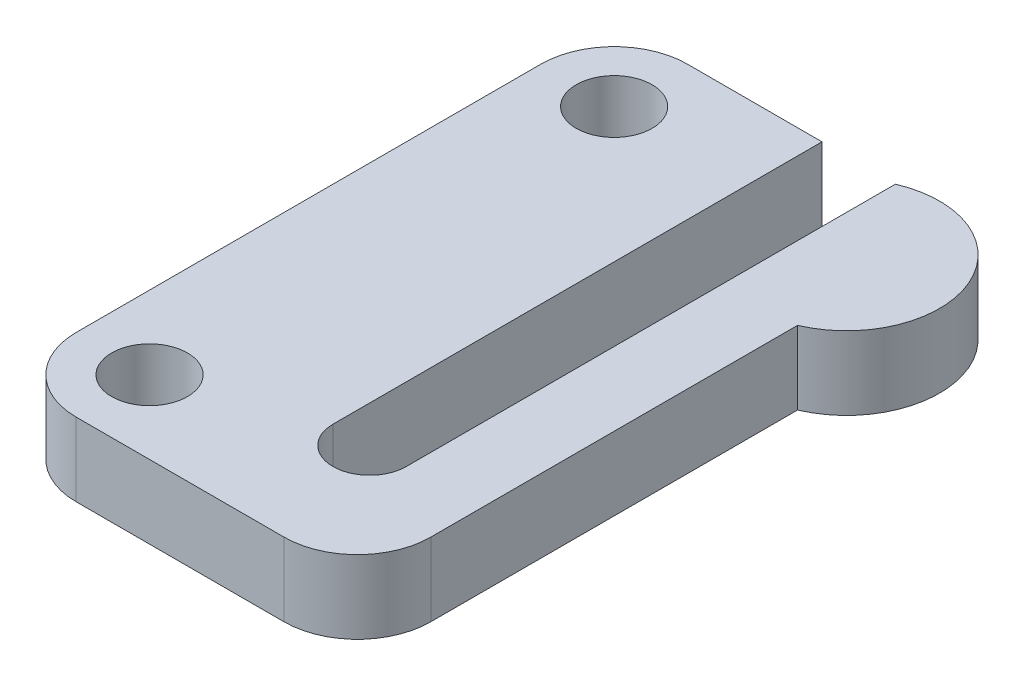
ISO-10303-21;
HEADER;
FILE_DESCRIPTION(('STEP AP214'),'2;1');
FILE_NAME('part.step','',(''),(''),'','','');
FILE_SCHEMA(('AUTOMOTIVE_DESIGN { 1 0 10303 214 1 1 1 1 }'));
ENDSEC;
DATA;
#1=APPLICATION_CONTEXT('core data for automotive mechanical design processes');
#2=APPLICATION_PROTOCOL_DEFINITION('international standard','automotive_design',2000,#1);
#3=PRODUCT_CONTEXT('',#1,'mechanical');
#4=PRODUCT('Part','Part','',(#3));
#5=PRODUCT_RELATED_PRODUCT_CATEGORY('part','',(#4));
#6=PRODUCT_DEFINITION_FORMATION('','',#4);
#7=PRODUCT_DEFINITION_CONTEXT('part definition',#1,'design');
#8=PRODUCT_DEFINITION('design','',#6,#7);
#9=PRODUCT_DEFINITION_SHAPE('','',#8);
#10=(LENGTH_UNIT() NAMED_UNIT(*) SI_UNIT(.MILLI.,.METRE.));
#11=(NAMED_UNIT(*) PLANE_ANGLE_UNIT() SI_UNIT($,.RADIAN.));
#12=(NAMED_UNIT(*) SI_UNIT($,.STERADIAN.) SOLID_ANGLE_UNIT());
#13=UNCERTAINTY_MEASURE_WITH_UNIT(LENGTH_MEASURE(1.E-05),#10,'distance_accuracy_value','');
#14=(GEOMETRIC_REPRESENTATION_CONTEXT(3) GLOBAL_UNCERTAINTY_ASSIGNED_CONTEXT((#13)) GLOBAL_UNIT_ASSIGNED_CONTEXT((#10,
#11,#12)) REPRESENTATION_CONTEXT('',''));
#15=CARTESIAN_POINT('',(0.,0.,0.));
#16=DIRECTION('',(0.,0.,1.));
#17=DIRECTION('',(1.,0.,0.));
#18=AXIS2_PLACEMENT_3D('',#15,#16,#17);
#19=CARTESIAN_POINT('',(0.499999999999998,-3.,-9.));
#20=DIRECTION('',(0.,1.,0.));
#21=DIRECTION('',(0.,0.,1.));
#22=AXIS2_PLACEMENT_3D('',#19,#20,#21);
#23=CYLINDRICAL_SURFACE('',#22,3.80788655293195);
#24=CARTESIAN_POINT('',(0.499999999999998,0.,-9.));
#25=DIRECTION('',(0.,1.,0.));
#26=DIRECTION('',(0.,0.,1.));
#27=AXIS2_PLACEMENT_3D('',#24,#25,#26);
#28=CIRCLE('',#27,3.80788655293195);
#29=CARTESIAN_POINT('',(2.,0.,-5.5));
#30=VERTEX_POINT('',#29);
#31=CARTESIAN_POINT('',(-0.999999999999998,0.,-12.5));
#32=VERTEX_POINT('',#31);
#33=EDGE_CURVE('E164',#30,#32,#28,.T.);
#34=ORIENTED_EDGE('',*,*,#33,.F.);
#35=DIRECTION('',(0.,1.,0.));
#36=VECTOR('',#35,1.);
#37=CARTESIAN_POINT('',(2.,-3.,-5.5));
#38=LINE('',#37,#36);
#39=CARTESIAN_POINT('',(2.,-3.,-5.5));
#40=VERTEX_POINT('',#39);
#41=EDGE_CURVE('E143',#40,#30,#38,.T.);
#42=ORIENTED_EDGE('',*,*,#41,.F.);
#43=CARTESIAN_POINT('',(0.499999999999998,-3.,-9.));
#44=DIRECTION('',(0.,1.,0.));
#45=DIRECTION('',(0.,0.,1.));
#46=AXIS2_PLACEMENT_3D('',#43,#44,#45);
#47=CIRCLE('',#46,3.80788655293195);
#48=CARTESIAN_POINT('',(-0.999999999999998,-3.,-12.5));
#49=VERTEX_POINT('',#48);
#50=EDGE_CURVE('E136',#40,#49,#47,.T.);
#51=ORIENTED_EDGE('',*,*,#50,.T.);
#52=DIRECTION('',(0.,1.,0.));
#53=VECTOR('',#52,1.);
#54=CARTESIAN_POINT('',(-0.999999999999998,-3.,-12.5));
#55=LINE('',#54,#53);
#56=EDGE_CURVE('E119',#49,#32,#55,.T.);
#57=ORIENTED_EDGE('',*,*,#56,.T.);
#58=EDGE_LOOP('',(#34,#42,#51,#57));
#59=FACE_BOUND('',#58,.T.);
#60=ADVANCED_FACE('F33',(#59),#23,.T.);
#61=CARTESIAN_POINT('',(2.,-3.,7.5));
#62=DIRECTION('',(1.,0.,0.));
#63=DIRECTION('',(0.,0.,-1.));
#64=AXIS2_PLACEMENT_3D('',#61,#62,#63);
#65=PLANE('',#64);
#66=DIRECTION('',(0.,0.,-1.));
#67=VECTOR('',#66,1.);
#68=CARTESIAN_POINT('',(2.,0.,7.5));
#69=LINE('',#68,#67);
#70=CARTESIAN_POINT('',(2.,0.,9.5));
#71=VERTEX_POINT('',#70);
#72=EDGE_CURVE('E144',#71,#30,#69,.T.);
#73=ORIENTED_EDGE('',*,*,#72,.F.);
#74=DIRECTION('',(0.,1.,0.));
#75=VECTOR('',#74,1.);
#76=CARTESIAN_POINT('',(2.,-3.,9.5));
#77=LINE('',#76,#75);
#78=CARTESIAN_POINT('',(2.,-3.,9.5));
#79=VERTEX_POINT('',#78);
#80=EDGE_CURVE('E192',#71,#79,#77,.F.);
#81=ORIENTED_EDGE('',*,*,#80,.T.);
#82=DIRECTION('',(0.,0.,-1.));
#83=VECTOR('',#82,1.);
#84=CARTESIAN_POINT('',(2.,-3.,12.5));
#85=LINE('',#84,#83);
#86=EDGE_CURVE('E130',#79,#40,#85,.T.);
#87=ORIENTED_EDGE('',*,*,#86,.T.);
#88=ORIENTED_EDGE('',*,*,#41,.T.);
#89=EDGE_LOOP('',(#73,#81,#87,#88));
#90=FACE_BOUND('',#89,.T.);
#91=ADVANCED_FACE('F226',(#90),#65,.T.);
#92=CARTESIAN_POINT('',(-12.5,-3.,12.5));
#93=DIRECTION('',(0.,0.,1.));
#94=DIRECTION('',(1.,0.,0.));
#95=AXIS2_PLACEMENT_3D('',#92,#93,#94);
#96=PLANE('',#95);
#97=DIRECTION('',(1.,0.,0.));
#98=VECTOR('',#97,1.);
#99=CARTESIAN_POINT('',(-12.5,0.,12.5));
#100=LINE('',#99,#98);
#101=CARTESIAN_POINT('',(-9.5,0.,12.5));
#102=VERTEX_POINT('',#101);
#103=CARTESIAN_POINT('',(-1.,0.,12.5));
#104=VERTEX_POINT('',#103);
#105=EDGE_CURVE('E146',#102,#104,#100,.T.);
#106=ORIENTED_EDGE('',*,*,#105,.F.);
#107=DIRECTION('',(0.,1.,0.));
#108=VECTOR('',#107,1.);
#109=CARTESIAN_POINT('',(-9.5,-3.,12.5));
#110=LINE('',#109,#108);
#111=CARTESIAN_POINT('',(-9.5,-3.,12.5));
#112=VERTEX_POINT('',#111);
#113=EDGE_CURVE('E56',#102,#112,#110,.F.);
#114=ORIENTED_EDGE('',*,*,#113,.T.);
#115=DIRECTION('',(1.,0.,0.));
#116=VECTOR('',#115,1.);
#117=CARTESIAN_POINT('',(-12.5,-3.,12.5));
#118=LINE('',#117,#116);
#119=CARTESIAN_POINT('',(-1.,-3.,12.5));
#120=VERTEX_POINT('',#119);
#121=EDGE_CURVE('E161',#112,#120,#118,.T.);
#122=ORIENTED_EDGE('',*,*,#121,.T.);
#123=DIRECTION('',(0.,1.,0.));
#124=VECTOR('',#123,1.);
#125=CARTESIAN_POINT('',(-0.999999999999999,-3.,12.5));
#126=LINE('',#125,#124);
#127=EDGE_CURVE('E182',#120,#104,#126,.T.);
#128=ORIENTED_EDGE('',*,*,#127,.T.);
#129=EDGE_LOOP('',(#106,#114,#122,#128));
#130=FACE_BOUND('',#129,.T.);
#131=ADVANCED_FACE('F218',(#130),#96,.T.);
#132=CARTESIAN_POINT('',(-12.5,-3.,12.5));
#133=DIRECTION('',(-1.,0.,0.));
#134=DIRECTION('',(0.,0.,1.));
#135=AXIS2_PLACEMENT_3D('',#132,#133,#134);
#136=PLANE('',#135);
#137=DIRECTION('',(0.,0.,1.));
#138=VECTOR('',#137,1.);
#139=CARTESIAN_POINT('',(-12.5,-3.,12.5));
#140=LINE('',#139,#138);
#141=CARTESIAN_POINT('',(-12.5,-3.,-9.49999999999999));
#142=VERTEX_POINT('',#141);
#143=CARTESIAN_POINT('',(-12.5,-3.,9.5));
#144=VERTEX_POINT('',#143);
#145=EDGE_CURVE('E158',#142,#144,#140,.T.);
#146=ORIENTED_EDGE('',*,*,#145,.T.);
#147=DIRECTION('',(0.,1.,0.));
#148=VECTOR('',#147,1.);
#149=CARTESIAN_POINT('',(-12.5,-3.,9.5));
#150=LINE('',#149,#148);
#151=CARTESIAN_POINT('',(-12.5,0.,9.5));
#152=VERTEX_POINT('',#151);
#153=EDGE_CURVE('E199',#144,#152,#150,.T.);
#154=ORIENTED_EDGE('',*,*,#153,.T.);
#155=DIRECTION('',(0.,0.,1.));
#156=VECTOR('',#155,1.);
#157=CARTESIAN_POINT('',(-12.5,0.,12.5));
#158=LINE('',#157,#156);
#159=CARTESIAN_POINT('',(-12.5,0.,-9.49999999999999));
#160=VERTEX_POINT('',#159);
#161=EDGE_CURVE('E177',#160,#152,#158,.T.);
#162=ORIENTED_EDGE('',*,*,#161,.F.);
#163=DIRECTION('',(0.,1.,0.));
#164=VECTOR('',#163,1.);
#165=CARTESIAN_POINT('',(-12.5,-3.,-9.5));
#166=LINE('',#165,#164);
#167=EDGE_CURVE('E197',#160,#142,#166,.F.);
#168=ORIENTED_EDGE('',*,*,#167,.T.);
#169=EDGE_LOOP('',(#146,#154,#162,#168));
#170=FACE_BOUND('',#169,.T.);
#171=ADVANCED_FACE('F211',(#170),#136,.T.);
#172=CARTESIAN_POINT('',(-4.,-3.,-12.5));
#173=DIRECTION('',(0.,0.,-1.));
#174=DIRECTION('',(-1.,0.,0.));
#175=AXIS2_PLACEMENT_3D('',#172,#173,#174);
#176=PLANE('',#175);
#177=DIRECTION('',(-1.,0.,0.));
#178=VECTOR('',#177,1.);
#179=CARTESIAN_POINT('',(-4.,-3.,-12.5));
#180=LINE('',#179,#178);
#181=CARTESIAN_POINT('',(-4.,-3.,-12.5));
#182=VERTEX_POINT('',#181);
#183=CARTESIAN_POINT('',(-9.5,-3.,-12.5));
#184=VERTEX_POINT('',#183);
#185=EDGE_CURVE('E156',#182,#184,#180,.T.);
#186=ORIENTED_EDGE('',*,*,#185,.T.);
#187=DIRECTION('',(0.,1.,0.));
#188=VECTOR('',#187,1.);
#189=CARTESIAN_POINT('',(-9.5,-3.,-12.5));
#190=LINE('',#189,#188);
#191=CARTESIAN_POINT('',(-9.5,0.,-12.5));
#192=VERTEX_POINT('',#191);
#193=EDGE_CURVE('E11',#184,#192,#190,.T.);
#194=ORIENTED_EDGE('',*,*,#193,.T.);
#195=DIRECTION('',(-1.,0.,0.));
#196=VECTOR('',#195,1.);
#197=CARTESIAN_POINT('',(-4.,0.,-12.5));
#198=LINE('',#197,#196);
#199=CARTESIAN_POINT('',(-4.,0.,-12.5));
#200=VERTEX_POINT('',#199);
#201=EDGE_CURVE('E174',#200,#192,#198,.T.);
#202=ORIENTED_EDGE('',*,*,#201,.F.);
#203=DIRECTION('',(0.,1.,0.));
#204=VECTOR('',#203,1.);
#205=CARTESIAN_POINT('',(-4.,-3.,-12.5));
#206=LINE('',#205,#204);
#207=EDGE_CURVE('E183',#182,#200,#206,.T.);
#208=ORIENTED_EDGE('',*,*,#207,.F.);
#209=EDGE_LOOP('',(#186,#194,#202,#208));
#210=FACE_BOUND('',#209,.T.);
#211=ADVANCED_FACE('F235',(#210),#176,.T.);
#212=CARTESIAN_POINT('',(-4.,-3.,7.5));
#213=DIRECTION('',(1.,0.,0.));
#214=DIRECTION('',(0.,0.,-1.));
#215=AXIS2_PLACEMENT_3D('',#212,#213,#214);
#216=PLANE('',#215);
#217=DIRECTION('',(0.,0.,-1.));
#218=VECTOR('',#217,1.);
#219=CARTESIAN_POINT('',(-4.,0.,7.5));
#220=LINE('',#219,#218);
#221=CARTESIAN_POINT('',(-4.,0.,7.5));
#222=VERTEX_POINT('',#221);
#223=EDGE_CURVE('E171',#222,#200,#220,.T.);
#224=ORIENTED_EDGE('',*,*,#223,.F.);
#225=DIRECTION('',(0.,1.,0.));
#226=VECTOR('',#225,1.);
#227=CARTESIAN_POINT('',(-4.,-3.,7.5));
#228=LINE('',#227,#226);
#229=CARTESIAN_POINT('',(-4.,-3.,7.5));
#230=VERTEX_POINT('',#229);
#231=EDGE_CURVE('E185',#230,#222,#228,.T.);
#232=ORIENTED_EDGE('',*,*,#231,.F.);
#233=DIRECTION('',(0.,0.,-1.));
#234=VECTOR('',#233,1.);
#235=CARTESIAN_POINT('',(-4.,-3.,7.5));
#236=LINE('',#235,#234);
#237=EDGE_CURVE('E153',#230,#182,#236,.T.);
#238=ORIENTED_EDGE('',*,*,#237,.T.);
#239=ORIENTED_EDGE('',*,*,#207,.T.);
#240=EDGE_LOOP('',(#224,#232,#238,#239));
#241=FACE_BOUND('',#240,.T.);
#242=ADVANCED_FACE('F232',(#241),#216,.T.);
#243=CARTESIAN_POINT('',(-2.5,-3.,7.5));
#244=DIRECTION('',(0.,1.,0.));
#245=DIRECTION('',(0.,0.,1.));
#246=AXIS2_PLACEMENT_3D('',#243,#244,#245);
#247=CYLINDRICAL_SURFACE('',#246,1.5);
#248=CARTESIAN_POINT('',(-2.5,0.,7.5));
#249=DIRECTION('',(0.,-1.,0.));
#250=DIRECTION('',(0.,0.,-1.));
#251=AXIS2_PLACEMENT_3D('',#248,#249,#250);
#252=CIRCLE('',#251,1.5);
#253=CARTESIAN_POINT('',(-0.999999999999996,0.,7.5));
#254=VERTEX_POINT('',#253);
#255=EDGE_CURVE('E168',#254,#222,#252,.T.);
#256=ORIENTED_EDGE('',*,*,#255,.F.);
#257=DIRECTION('',(0.,1.,0.));
#258=VECTOR('',#257,1.);
#259=CARTESIAN_POINT('',(-0.999999999999996,-3.,7.5));
#260=LINE('',#259,#258);
#261=CARTESIAN_POINT('',(-0.999999999999996,-3.,7.5));
#262=VERTEX_POINT('',#261);
#263=EDGE_CURVE('E129',#262,#254,#260,.T.);
#264=ORIENTED_EDGE('',*,*,#263,.F.);
#265=CARTESIAN_POINT('',(-2.5,-3.,7.5));
#266=DIRECTION('',(0.,-1.,0.));
#267=DIRECTION('',(0.,0.,-1.));
#268=AXIS2_PLACEMENT_3D('',#265,#266,#267);
#269=CIRCLE('',#268,1.5);
#270=EDGE_CURVE('E139',#262,#230,#269,.T.);
#271=ORIENTED_EDGE('',*,*,#270,.T.);
#272=ORIENTED_EDGE('',*,*,#231,.T.);
#273=EDGE_LOOP('',(#256,#264,#271,#272));
#274=FACE_BOUND('',#273,.T.);
#275=ADVANCED_FACE('F230',(#274),#247,.F.);
#276=CARTESIAN_POINT('',(-0.999999999999998,-3.,-12.5));
#277=DIRECTION('',(-1.,0.,0.));
#278=DIRECTION('',(0.,0.,1.));
#279=AXIS2_PLACEMENT_3D('',#276,#277,#278);
#280=PLANE('',#279);
#281=DIRECTION('',(0.,0.,1.));
#282=VECTOR('',#281,1.);
#283=CARTESIAN_POINT('',(-0.999999999999998,0.,-12.5));
#284=LINE('',#283,#282);
#285=EDGE_CURVE('E124',#32,#254,#284,.T.);
#286=ORIENTED_EDGE('',*,*,#285,.F.);
#287=ORIENTED_EDGE('',*,*,#56,.F.);
#288=DIRECTION('',(0.,0.,1.));
#289=VECTOR('',#288,1.);
#290=CARTESIAN_POINT('',(-0.999999999999998,-3.,-12.5));
#291=LINE('',#290,#289);
#292=EDGE_CURVE('E122',#49,#262,#291,.T.);
#293=ORIENTED_EDGE('',*,*,#292,.T.);
#294=ORIENTED_EDGE('',*,*,#263,.T.);
#295=EDGE_LOOP('',(#286,#287,#293,#294));
#296=FACE_BOUND('',#295,.T.);
#297=ADVANCED_FACE('F121',(#296),#280,.T.);
#298=CARTESIAN_POINT('',(0.499999999999998,-3.,-9.));
#299=DIRECTION('',(0.,1.,0.));
#300=DIRECTION('',(0.,0.,1.));
#301=AXIS2_PLACEMENT_3D('',#298,#299,#300);
#302=PLANE('',#301);
#303=CARTESIAN_POINT('',(-9.4999999999998,-3.,9.5));
#304=DIRECTION('',(0.,1.,0.));
#305=DIRECTION('',(0.,0.,1.));
#306=AXIS2_PLACEMENT_3D('',#303,#304,#305);
#307=CIRCLE('',#306,1.55);
#308=CARTESIAN_POINT('',(-9.4999999999998,-3.,11.05));
#309=VERTEX_POINT('',#308);
#310=EDGE_CURVE('E374',#309,#309,#307,.T.);
#311=ORIENTED_EDGE('',*,*,#310,.T.);
#312=EDGE_LOOP('',(#311));
#313=FACE_BOUND('',#312,.T.);
#314=CARTESIAN_POINT('',(-9.5,-3.,-9.5));
#315=DIRECTION('',(0.,1.,0.));
#316=DIRECTION('',(0.,0.,1.));
#317=AXIS2_PLACEMENT_3D('',#314,#315,#316);
#318=CIRCLE('',#317,1.55);
#319=CARTESIAN_POINT('',(-9.5,-3.,-7.95));
#320=VERTEX_POINT('',#319);
#321=EDGE_CURVE('E166',#320,#320,#318,.T.);
#322=ORIENTED_EDGE('',*,*,#321,.T.);
#323=EDGE_LOOP('',(#322));
#324=FACE_BOUND('',#323,.T.);
#325=ORIENTED_EDGE('',*,*,#121,.F.);
#326=CARTESIAN_POINT('',(-9.5,-3.,9.5));
#327=DIRECTION('',(0.,1.,0.));
#328=DIRECTION('',(0.,0.,1.));
#329=AXIS2_PLACEMENT_3D('',#326,#327,#328);
#330=CIRCLE('',#329,3.);
#331=EDGE_CURVE('E41',#112,#144,#330,.F.);
#332=ORIENTED_EDGE('',*,*,#331,.T.);
#333=ORIENTED_EDGE('',*,*,#145,.F.);
#334=CARTESIAN_POINT('',(-9.5,-3.,-9.5));
#335=DIRECTION('',(0.,1.,0.));
#336=DIRECTION('',(0.,0.,1.));
#337=AXIS2_PLACEMENT_3D('',#334,#335,#336);
#338=CIRCLE('',#337,3.);
#339=EDGE_CURVE('E48',#142,#184,#338,.F.);
#340=ORIENTED_EDGE('',*,*,#339,.T.);
#341=ORIENTED_EDGE('',*,*,#185,.F.);
#342=ORIENTED_EDGE('',*,*,#237,.F.);
#343=ORIENTED_EDGE('',*,*,#270,.F.);
#344=ORIENTED_EDGE('',*,*,#292,.F.);
#345=ORIENTED_EDGE('',*,*,#50,.F.);
#346=ORIENTED_EDGE('',*,*,#86,.F.);
#347=CARTESIAN_POINT('',(-0.999999999999999,-3.,9.5));
#348=DIRECTION('',(0.,1.,0.));
#349=DIRECTION('',(0.,0.,1.));
#350=AXIS2_PLACEMENT_3D('',#347,#348,#349);
#351=CIRCLE('',#350,3.);
#352=EDGE_CURVE('E194',#79,#120,#351,.F.);
#353=ORIENTED_EDGE('',*,*,#352,.T.);
#354=EDGE_LOOP('',(#325,#332,#333,#340,#341,#342,#343,#344,#345,#346,#353));
#355=FACE_BOUND('',#354,.T.);
#356=ADVANCED_FACE('F134',(#313,#324,#355),#302,.F.);
#357=CARTESIAN_POINT('',(0.499999999999998,0.,-9.));
#358=DIRECTION('',(0.,1.,0.));
#359=DIRECTION('',(0.,0.,1.));
#360=AXIS2_PLACEMENT_3D('',#357,#358,#359);
#361=PLANE('',#360);
#362=CARTESIAN_POINT('',(-9.4999999999998,0.,9.5));
#363=DIRECTION('',(0.,1.,0.));
#364=DIRECTION('',(0.,0.,1.));
#365=AXIS2_PLACEMENT_3D('',#362,#363,#364);
#366=CIRCLE('',#365,1.55);
#367=CARTESIAN_POINT('',(-9.4999999999998,0.,11.05));
#368=VERTEX_POINT('',#367);
#369=EDGE_CURVE('E370',#368,#368,#366,.T.);
#370=ORIENTED_EDGE('',*,*,#369,.F.);
#371=EDGE_LOOP('',(#370));
#372=FACE_BOUND('',#371,.T.);
#373=CARTESIAN_POINT('',(-9.5,0.,-9.5));
#374=DIRECTION('',(0.,1.,0.));
#375=DIRECTION('',(0.,0.,1.));
#376=AXIS2_PLACEMENT_3D('',#373,#374,#375);
#377=CIRCLE('',#376,1.55);
#378=CARTESIAN_POINT('',(-9.5,0.,-7.95));
#379=VERTEX_POINT('',#378);
#380=EDGE_CURVE('E149',#379,#379,#377,.T.);
#381=ORIENTED_EDGE('',*,*,#380,.F.);
#382=EDGE_LOOP('',(#381));
#383=FACE_BOUND('',#382,.T.);
#384=ORIENTED_EDGE('',*,*,#161,.T.);
#385=CARTESIAN_POINT('',(-9.5,0.,9.5));
#386=DIRECTION('',(0.,1.,0.));
#387=DIRECTION('',(0.,0.,1.));
#388=AXIS2_PLACEMENT_3D('',#385,#386,#387);
#389=CIRCLE('',#388,3.);
#390=EDGE_CURVE('E204',#152,#102,#389,.T.);
#391=ORIENTED_EDGE('',*,*,#390,.T.);
#392=ORIENTED_EDGE('',*,*,#105,.T.);
#393=CARTESIAN_POINT('',(-0.999999999999999,0.,9.5));
#394=DIRECTION('',(0.,1.,0.));
#395=DIRECTION('',(0.,0.,1.));
#396=AXIS2_PLACEMENT_3D('',#393,#394,#395);
#397=CIRCLE('',#396,3.);
#398=EDGE_CURVE('E190',#104,#71,#397,.T.);
#399=ORIENTED_EDGE('',*,*,#398,.T.);
#400=ORIENTED_EDGE('',*,*,#72,.T.);
#401=ORIENTED_EDGE('',*,*,#33,.T.);
#402=ORIENTED_EDGE('',*,*,#285,.T.);
#403=ORIENTED_EDGE('',*,*,#255,.T.);
#404=ORIENTED_EDGE('',*,*,#223,.T.);
#405=ORIENTED_EDGE('',*,*,#201,.T.);
#406=CARTESIAN_POINT('',(-9.5,0.,-9.5));
#407=DIRECTION('',(0.,1.,0.));
#408=DIRECTION('',(0.,0.,1.));
#409=AXIS2_PLACEMENT_3D('',#406,#407,#408);
#410=CIRCLE('',#409,3.);
#411=EDGE_CURVE('E202',#192,#160,#410,.T.);
#412=ORIENTED_EDGE('',*,*,#411,.T.);
#413=EDGE_LOOP('',(#384,#391,#392,#399,#400,#401,#402,#403,#404,#405,#412));
#414=FACE_BOUND('',#413,.T.);
#415=ADVANCED_FACE('F216',(#372,#383,#414),#361,.T.);
#416=CARTESIAN_POINT('',(-9.5,-3.,-9.5));
#417=DIRECTION('',(0.,1.,0.));
#418=DIRECTION('',(0.,0.,1.));
#419=AXIS2_PLACEMENT_3D('',#416,#417,#418);
#420=CYLINDRICAL_SURFACE('',#419,1.55);
#421=ORIENTED_EDGE('',*,*,#321,.F.);
#422=EDGE_LOOP('',(#421));
#423=FACE_BOUND('',#422,.T.);
#424=ORIENTED_EDGE('',*,*,#380,.T.);
#425=EDGE_LOOP('',(#424));
#426=FACE_BOUND('',#425,.T.);
#427=ADVANCED_FACE('F256',(#423,#426),#420,.F.);
#428=CARTESIAN_POINT('',(-9.4999999999998,-3.,9.5));
#429=DIRECTION('',(0.,1.,0.));
#430=DIRECTION('',(0.,0.,1.));
#431=AXIS2_PLACEMENT_3D('',#428,#429,#430);
#432=CYLINDRICAL_SURFACE('',#431,1.55);
#433=ORIENTED_EDGE('',*,*,#310,.F.);
#434=EDGE_LOOP('',(#433));
#435=FACE_BOUND('',#434,.T.);
#436=ORIENTED_EDGE('',*,*,#369,.T.);
#437=EDGE_LOOP('',(#436));
#438=FACE_BOUND('',#437,.T.);
#439=ADVANCED_FACE('F252',(#435,#438),#432,.F.);
#440=CARTESIAN_POINT('',(-0.999999999999999,-3.,9.5));
#441=DIRECTION('',(0.,1.,0.));
#442=DIRECTION('',(0.,0.,1.));
#443=AXIS2_PLACEMENT_3D('',#440,#441,#442);
#444=CYLINDRICAL_SURFACE('',#443,3.);
#445=ORIENTED_EDGE('',*,*,#352,.F.);
#446=ORIENTED_EDGE('',*,*,#80,.F.);
#447=ORIENTED_EDGE('',*,*,#398,.F.);
#448=ORIENTED_EDGE('',*,*,#127,.F.);
#449=EDGE_LOOP('',(#445,#446,#447,#448));
#450=FACE_BOUND('',#449,.T.);
#451=ADVANCED_FACE('F222',(#450),#444,.T.);
#452=CARTESIAN_POINT('',(-9.5,-3.,9.5));
#453=DIRECTION('',(0.,1.,0.));
#454=DIRECTION('',(0.,0.,1.));
#455=AXIS2_PLACEMENT_3D('',#452,#453,#454);
#456=CYLINDRICAL_SURFACE('',#455,3.);
#457=ORIENTED_EDGE('',*,*,#331,.F.);
#458=ORIENTED_EDGE('',*,*,#113,.F.);
#459=ORIENTED_EDGE('',*,*,#390,.F.);
#460=ORIENTED_EDGE('',*,*,#153,.F.);
#461=EDGE_LOOP('',(#457,#458,#459,#460));
#462=FACE_BOUND('',#461,.T.);
#463=ADVANCED_FACE('F214',(#462),#456,.T.);
#464=CARTESIAN_POINT('',(-9.5,-3.,-9.5));
#465=DIRECTION('',(0.,1.,0.));
#466=DIRECTION('',(0.,0.,1.));
#467=AXIS2_PLACEMENT_3D('',#464,#465,#466);
#468=CYLINDRICAL_SURFACE('',#467,3.);
#469=ORIENTED_EDGE('',*,*,#339,.F.);
#470=ORIENTED_EDGE('',*,*,#167,.F.);
#471=ORIENTED_EDGE('',*,*,#411,.F.);
#472=ORIENTED_EDGE('',*,*,#193,.F.);
#473=EDGE_LOOP('',(#469,#470,#471,#472));
#474=FACE_BOUND('',#473,.T.);
#475=ADVANCED_FACE('F35',(#474),#468,.T.);
#476=CLOSED_SHELL('',(#60,#91,#131,#171,#211,#242,#275,#297,#356,#415,#427,#439,#451,#463,#475));
#477=MANIFOLD_SOLID_BREP('B2',#476);
#478=ADVANCED_BREP_SHAPE_REPRESENTATION('',(#18,#477),#14);
#479=SHAPE_DEFINITION_REPRESENTATION(#9,#478);
ENDSEC;
END-ISO-10303-21;
